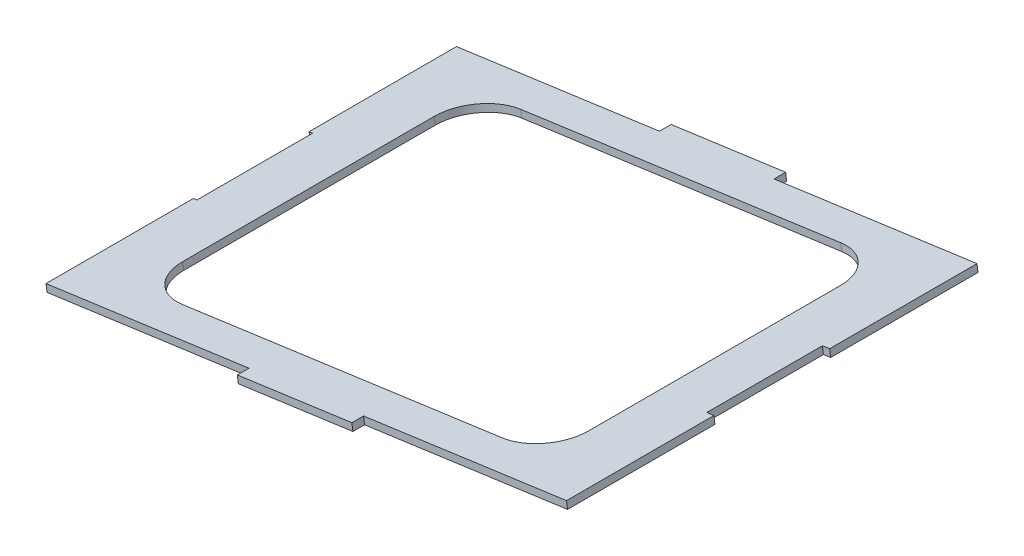
ISO-10303-21;
HEADER;
FILE_DESCRIPTION(('STEP AP214'),'2;1');
FILE_NAME('part.step','',(''),(''),'','','');
FILE_SCHEMA(('AUTOMOTIVE_DESIGN { 1 0 10303 214 1 1 1 1 }'));
ENDSEC;
DATA;
#1=APPLICATION_CONTEXT('core data for automotive mechanical design processes');
#2=APPLICATION_PROTOCOL_DEFINITION('international standard','automotive_design',2000,#1);
#3=PRODUCT_CONTEXT('',#1,'mechanical');
#4=PRODUCT('Part','Part','',(#3));
#5=PRODUCT_RELATED_PRODUCT_CATEGORY('part','',(#4));
#6=PRODUCT_DEFINITION_FORMATION('','',#4);
#7=PRODUCT_DEFINITION_CONTEXT('part definition',#1,'design');
#8=PRODUCT_DEFINITION('design','',#6,#7);
#9=PRODUCT_DEFINITION_SHAPE('','',#8);
#10=(LENGTH_UNIT() NAMED_UNIT(*) SI_UNIT(.MILLI.,.METRE.));
#11=(NAMED_UNIT(*) PLANE_ANGLE_UNIT() SI_UNIT($,.RADIAN.));
#12=(NAMED_UNIT(*) SI_UNIT($,.STERADIAN.) SOLID_ANGLE_UNIT());
#13=UNCERTAINTY_MEASURE_WITH_UNIT(LENGTH_MEASURE(1.E-05),#10,'distance_accuracy_value','');
#14=(GEOMETRIC_REPRESENTATION_CONTEXT(3) GLOBAL_UNCERTAINTY_ASSIGNED_CONTEXT((#13)) GLOBAL_UNIT_ASSIGNED_CONTEXT((#10,
#11,#12)) REPRESENTATION_CONTEXT('',''));
#15=CARTESIAN_POINT('',(0.,0.,0.));
#16=DIRECTION('',(0.,0.,1.));
#17=DIRECTION('',(1.,0.,0.));
#18=AXIS2_PLACEMENT_3D('',#15,#16,#17);
#19=CARTESIAN_POINT('',(-235.809398036046,-171.80665594088,55.2069));
#20=DIRECTION('',(0.137568371274688,-0.990492273177752,0.));
#21=DIRECTION('',(0.990492273177752,0.137568371274688,0.));
#22=AXIS2_PLACEMENT_3D('',#19,#20,#21);
#23=CYLINDRICAL_SURFACE('',#22,19.05);
#24=CARTESIAN_POINT('',(-235.372618457249,-174.951468908219,55.2069));
#25=DIRECTION('',(0.137568371274688,-0.990492273177752,0.));
#26=DIRECTION('',(0.990492273177752,0.137568371274688,0.));
#27=AXIS2_PLACEMENT_3D('',#24,#25,#26);
#28=CIRCLE('',#27,19.05);
#29=CARTESIAN_POINT('',(-235.372618457249,-174.951468908219,74.2569));
#30=VERTEX_POINT('',#29);
#31=CARTESIAN_POINT('',(-254.241496261285,-177.572146381002,55.2069));
#32=VERTEX_POINT('',#31);
#33=EDGE_CURVE('E301',#30,#32,#28,.T.);
#34=ORIENTED_EDGE('',*,*,#33,.T.);
#35=DIRECTION('',(0.137568371274688,-0.990492273177752,0.));
#36=VECTOR('',#35,1.);
#37=CARTESIAN_POINT('',(-254.678275840082,-174.427333413663,55.2069));
#38=LINE('',#37,#36);
#39=CARTESIAN_POINT('',(-254.678275840082,-174.427333413663,55.2069));
#40=VERTEX_POINT('',#39);
#41=EDGE_CURVE('E11',#40,#32,#38,.T.);
#42=ORIENTED_EDGE('',*,*,#41,.F.);
#43=CARTESIAN_POINT('',(-235.809398036046,-171.80665594088,55.2069));
#44=DIRECTION('',(0.137568371274688,-0.990492273177752,0.));
#45=DIRECTION('',(0.990492273177752,0.137568371274688,0.));
#46=AXIS2_PLACEMENT_3D('',#43,#44,#45);
#47=CIRCLE('',#46,19.05);
#48=CARTESIAN_POINT('',(-235.809398036046,-171.80665594088,74.2569));
#49=VERTEX_POINT('',#48);
#50=EDGE_CURVE('E408',#49,#40,#47,.T.);
#51=ORIENTED_EDGE('',*,*,#50,.F.);
#52=DIRECTION('',(0.137568371274688,-0.990492273177752,0.));
#53=VECTOR('',#52,1.);
#54=CARTESIAN_POINT('',(-235.809398036046,-171.80665594088,74.2569));
#55=LINE('',#54,#53);
#56=EDGE_CURVE('E329',#49,#30,#55,.T.);
#57=ORIENTED_EDGE('',*,*,#56,.T.);
#58=EDGE_LOOP('',(#34,#42,#51,#57));
#59=FACE_BOUND('',#58,.T.);
#60=ADVANCED_FACE('F35',(#59),#23,.F.);
#61=CARTESIAN_POINT('',(-254.678275840082,-174.427333413663,0.));
#62=DIRECTION('',(-0.990492273177752,-0.137568371274688,0.));
#63=DIRECTION('',(0.137568371274688,-0.990492273177752,0.));
#64=AXIS2_PLACEMENT_3D('',#61,#62,#63);
#65=PLANE('',#64);
#66=DIRECTION('',(0.,0.,-1.));
#67=VECTOR('',#66,1.);
#68=CARTESIAN_POINT('',(-254.241496261285,-177.572146381002,0.));
#69=LINE('',#68,#67);
#70=CARTESIAN_POINT('',(-254.241496261285,-177.572146381002,-55.2069000000001));
#71=VERTEX_POINT('',#70);
#72=EDGE_CURVE('E139',#32,#71,#69,.T.);
#73=ORIENTED_EDGE('',*,*,#72,.T.);
#74=DIRECTION('',(0.137568371274688,-0.990492273177752,0.));
#75=VECTOR('',#74,1.);
#76=CARTESIAN_POINT('',(-254.678275840082,-174.427333413663,-55.2069000000001));
#77=LINE('',#76,#75);
#78=CARTESIAN_POINT('',(-254.678275840082,-174.427333413663,-55.2069000000001));
#79=VERTEX_POINT('',#78);
#80=EDGE_CURVE('E45',#79,#71,#77,.T.);
#81=ORIENTED_EDGE('',*,*,#80,.F.);
#82=DIRECTION('',(0.,0.,-1.));
#83=VECTOR('',#82,1.);
#84=CARTESIAN_POINT('',(-254.678275840082,-174.427333413663,0.));
#85=LINE('',#84,#83);
#86=EDGE_CURVE('E53',#40,#79,#85,.T.);
#87=ORIENTED_EDGE('',*,*,#86,.F.);
#88=ORIENTED_EDGE('',*,*,#41,.T.);
#89=EDGE_LOOP('',(#73,#81,#87,#88));
#90=FACE_BOUND('',#89,.T.);
#91=ADVANCED_FACE('F435',(#90),#65,.F.);
#92=CARTESIAN_POINT('',(-235.809398036046,-171.80665594088,-55.2069000000001));
#93=DIRECTION('',(0.137568371274688,-0.990492273177752,0.));
#94=DIRECTION('',(0.990492273177752,0.137568371274688,0.));
#95=AXIS2_PLACEMENT_3D('',#92,#93,#94);
#96=CYLINDRICAL_SURFACE('',#95,19.05);
#97=CARTESIAN_POINT('',(-235.372618457249,-174.951468908219,-55.2069000000001));
#98=DIRECTION('',(0.137568371274688,-0.990492273177752,0.));
#99=DIRECTION('',(0.990492273177752,0.137568371274688,0.));
#100=AXIS2_PLACEMENT_3D('',#97,#98,#99);
#101=CIRCLE('',#100,19.05);
#102=CARTESIAN_POINT('',(-235.372618457249,-174.951468908219,-74.2569000000001));
#103=VERTEX_POINT('',#102);
#104=EDGE_CURVE('E237',#71,#103,#101,.T.);
#105=ORIENTED_EDGE('',*,*,#104,.T.);
#106=DIRECTION('',(0.137568371274688,-0.990492273177752,0.));
#107=VECTOR('',#106,1.);
#108=CARTESIAN_POINT('',(-235.809398036046,-171.80665594088,-74.2569000000001));
#109=LINE('',#108,#107);
#110=CARTESIAN_POINT('',(-235.809398036046,-171.80665594088,-74.2569000000001));
#111=VERTEX_POINT('',#110);
#112=EDGE_CURVE('E235',#111,#103,#109,.T.);
#113=ORIENTED_EDGE('',*,*,#112,.F.);
#114=CARTESIAN_POINT('',(-235.809398036046,-171.80665594088,-55.2069000000001));
#115=DIRECTION('',(0.137568371274688,-0.990492273177752,0.));
#116=DIRECTION('',(0.990492273177752,0.137568371274688,0.));
#117=AXIS2_PLACEMENT_3D('',#114,#115,#116);
#118=CIRCLE('',#117,19.05);
#119=EDGE_CURVE('E226',#79,#111,#118,.T.);
#120=ORIENTED_EDGE('',*,*,#119,.F.);
#121=ORIENTED_EDGE('',*,*,#80,.T.);
#122=EDGE_LOOP('',(#105,#113,#120,#121));
#123=FACE_BOUND('',#122,.T.);
#124=ADVANCED_FACE('F236',(#123),#96,.F.);
#125=CARTESIAN_POINT('',(18.9477389238889,-136.423720252,-74.2569));
#126=DIRECTION('',(0.,0.,-1.));
#127=DIRECTION('',(-1.,0.,0.));
#128=AXIS2_PLACEMENT_3D('',#125,#126,#127);
#129=PLANE('',#128);
#130=DIRECTION('',(0.990492273177752,0.137568371274688,0.));
#131=VECTOR('',#130,1.);
#132=CARTESIAN_POINT('',(19.3845185026861,-139.568533219339,-74.2569));
#133=LINE('',#132,#131);
#134=CARTESIAN_POINT('',(-94.8273815427511,-155.431297114539,-74.2569000000001));
#135=VERTEX_POINT('',#134);
#136=EDGE_CURVE('E316',#103,#135,#133,.T.);
#137=ORIENTED_EDGE('',*,*,#136,.T.);
#138=DIRECTION('',(0.137568371274688,-0.990492273177752,0.));
#139=VECTOR('',#138,1.);
#140=CARTESIAN_POINT('',(-95.2641611215483,-152.2864841472,-74.2569000000001));
#141=LINE('',#140,#139);
#142=CARTESIAN_POINT('',(-95.2641611215483,-152.2864841472,-74.2569000000001));
#143=VERTEX_POINT('',#142);
#144=EDGE_CURVE('E240',#143,#135,#141,.T.);
#145=ORIENTED_EDGE('',*,*,#144,.F.);
#146=DIRECTION('',(0.990492273177752,0.137568371274688,0.));
#147=VECTOR('',#146,1.);
#148=CARTESIAN_POINT('',(18.9477389238889,-136.423720252,-74.2569));
#149=LINE('',#148,#147);
#150=EDGE_CURVE('E230',#111,#143,#149,.T.);
#151=ORIENTED_EDGE('',*,*,#150,.F.);
#152=ORIENTED_EDGE('',*,*,#112,.T.);
#153=EDGE_LOOP('',(#137,#145,#151,#152));
#154=FACE_BOUND('',#153,.T.);
#155=ADVANCED_FACE('F242',(#154),#129,.F.);
#156=CARTESIAN_POINT('',(-95.2641611215483,-152.2864841472,-55.2069000000001));
#157=DIRECTION('',(0.137568371274688,-0.990492273177752,0.));
#158=DIRECTION('',(0.990492273177752,0.137568371274688,0.));
#159=AXIS2_PLACEMENT_3D('',#156,#157,#158);
#160=CYLINDRICAL_SURFACE('',#159,19.05);
#161=CARTESIAN_POINT('',(-94.8273815427511,-155.431297114539,-55.2069000000001));
#162=DIRECTION('',(0.137568371274688,-0.990492273177752,0.));
#163=DIRECTION('',(0.990492273177752,0.137568371274688,0.));
#164=AXIS2_PLACEMENT_3D('',#161,#162,#163);
#165=CIRCLE('',#164,19.05);
#166=CARTESIAN_POINT('',(-75.958503738715,-152.810619641756,-55.2069000000001));
#167=VERTEX_POINT('',#166);
#168=EDGE_CURVE('E313',#135,#167,#165,.T.);
#169=ORIENTED_EDGE('',*,*,#168,.T.);
#170=DIRECTION('',(0.137568371274688,-0.990492273177752,0.));
#171=VECTOR('',#170,1.);
#172=CARTESIAN_POINT('',(-76.3952833175121,-149.665806674417,-55.2069000000001));
#173=LINE('',#172,#171);
#174=CARTESIAN_POINT('',(-76.3952833175121,-149.665806674417,-55.2069000000001));
#175=VERTEX_POINT('',#174);
#176=EDGE_CURVE('E323',#175,#167,#173,.T.);
#177=ORIENTED_EDGE('',*,*,#176,.F.);
#178=CARTESIAN_POINT('',(-95.2641611215483,-152.2864841472,-55.2069000000001));
#179=DIRECTION('',(0.137568371274688,-0.990492273177752,0.));
#180=DIRECTION('',(0.990492273177752,0.137568371274688,0.));
#181=AXIS2_PLACEMENT_3D('',#178,#179,#180);
#182=CIRCLE('',#181,19.05);
#183=EDGE_CURVE('E245',#143,#175,#182,.T.);
#184=ORIENTED_EDGE('',*,*,#183,.F.);
#185=ORIENTED_EDGE('',*,*,#144,.T.);
#186=EDGE_LOOP('',(#169,#177,#184,#185));
#187=FACE_BOUND('',#186,.T.);
#188=ADVANCED_FACE('F424',(#187),#160,.F.);
#189=CARTESIAN_POINT('',(-76.3952833175121,-149.665806674417,0.));
#190=DIRECTION('',(-0.990492273177752,-0.137568371274688,0.));
#191=DIRECTION('',(0.137568371274688,-0.990492273177752,0.));
#192=AXIS2_PLACEMENT_3D('',#189,#190,#191);
#193=PLANE('',#192);
#194=DIRECTION('',(0.,0.,-1.));
#195=VECTOR('',#194,1.);
#196=CARTESIAN_POINT('',(-75.958503738715,-152.810619641756,0.));
#197=LINE('',#196,#195);
#198=CARTESIAN_POINT('',(-75.958503738715,-152.810619641756,55.2069));
#199=VERTEX_POINT('',#198);
#200=EDGE_CURVE('E310',#199,#167,#197,.T.);
#201=ORIENTED_EDGE('',*,*,#200,.F.);
#202=DIRECTION('',(0.137568371274688,-0.990492273177752,0.));
#203=VECTOR('',#202,1.);
#204=CARTESIAN_POINT('',(-76.3952833175121,-149.665806674417,55.2069));
#205=LINE('',#204,#203);
#206=CARTESIAN_POINT('',(-76.3952833175121,-149.665806674417,55.2069));
#207=VERTEX_POINT('',#206);
#208=EDGE_CURVE('E325',#207,#199,#205,.T.);
#209=ORIENTED_EDGE('',*,*,#208,.F.);
#210=DIRECTION('',(0.,0.,-1.));
#211=VECTOR('',#210,1.);
#212=CARTESIAN_POINT('',(-76.3952833175121,-149.665806674417,0.));
#213=LINE('',#212,#211);
#214=EDGE_CURVE('E247',#207,#175,#213,.T.);
#215=ORIENTED_EDGE('',*,*,#214,.T.);
#216=ORIENTED_EDGE('',*,*,#176,.T.);
#217=EDGE_LOOP('',(#201,#209,#215,#216));
#218=FACE_BOUND('',#217,.T.);
#219=ADVANCED_FACE('F418',(#218),#193,.T.);
#220=CARTESIAN_POINT('',(-95.2641611215483,-152.2864841472,55.2069));
#221=DIRECTION('',(0.137568371274688,-0.990492273177752,0.));
#222=DIRECTION('',(0.990492273177752,0.137568371274688,0.));
#223=AXIS2_PLACEMENT_3D('',#220,#221,#222);
#224=CYLINDRICAL_SURFACE('',#223,19.05);
#225=CARTESIAN_POINT('',(-94.8273815427512,-155.431297114539,55.2069));
#226=DIRECTION('',(0.137568371274688,-0.990492273177752,0.));
#227=DIRECTION('',(0.990492273177752,0.137568371274688,0.));
#228=AXIS2_PLACEMENT_3D('',#225,#226,#227);
#229=CIRCLE('',#228,19.05);
#230=CARTESIAN_POINT('',(-94.8273815427512,-155.431297114539,74.2569));
#231=VERTEX_POINT('',#230);
#232=EDGE_CURVE('E307',#199,#231,#229,.T.);
#233=ORIENTED_EDGE('',*,*,#232,.T.);
#234=DIRECTION('',(0.137568371274688,-0.990492273177752,0.));
#235=VECTOR('',#234,1.);
#236=CARTESIAN_POINT('',(-95.2641611215483,-152.2864841472,74.2569));
#237=LINE('',#236,#235);
#238=CARTESIAN_POINT('',(-95.2641611215483,-152.2864841472,74.2569));
#239=VERTEX_POINT('',#238);
#240=EDGE_CURVE('E327',#239,#231,#237,.T.);
#241=ORIENTED_EDGE('',*,*,#240,.F.);
#242=CARTESIAN_POINT('',(-95.2641611215483,-152.2864841472,55.2069));
#243=DIRECTION('',(0.137568371274688,-0.990492273177752,0.));
#244=DIRECTION('',(0.990492273177752,0.137568371274688,0.));
#245=AXIS2_PLACEMENT_3D('',#242,#243,#244);
#246=CIRCLE('',#245,19.05);
#247=EDGE_CURVE('E413',#207,#239,#246,.T.);
#248=ORIENTED_EDGE('',*,*,#247,.F.);
#249=ORIENTED_EDGE('',*,*,#208,.T.);
#250=EDGE_LOOP('',(#233,#241,#248,#249));
#251=FACE_BOUND('',#250,.T.);
#252=ADVANCED_FACE('F429',(#251),#224,.F.);
#253=CARTESIAN_POINT('',(18.947738923889,-136.423720252,25.3999999999993));
#254=DIRECTION('',(0.,0.,-1.));
#255=DIRECTION('',(-1.,0.,0.));
#256=AXIS2_PLACEMENT_3D('',#253,#254,#255);
#257=PLANE('',#256);
#258=DIRECTION('',(0.990492273177752,0.137568371274688,0.));
#259=VECTOR('',#258,1.);
#260=CARTESIAN_POINT('',(19.3845185026861,-139.568533219339,25.3999999999993));
#261=LINE('',#260,#259);
#262=CARTESIAN_POINT('',(-279.4,-181.066383011379,25.4));
#263=VERTEX_POINT('',#262);
#264=CARTESIAN_POINT('',(-277.82759351633,-180.847993221981,25.4));
#265=VERTEX_POINT('',#264);
#266=EDGE_CURVE('E252',#263,#265,#261,.T.);
#267=ORIENTED_EDGE('',*,*,#266,.F.);
#268=DIRECTION('',(0.137568371274688,-0.990492273177752,0.));
#269=VECTOR('',#268,1.);
#270=CARTESIAN_POINT('',(-279.836779578797,-177.92157004404,25.4));
#271=LINE('',#270,#269);
#272=CARTESIAN_POINT('',(-279.836779578797,-177.92157004404,25.4));
#273=VERTEX_POINT('',#272);
#274=EDGE_CURVE('E331',#273,#263,#271,.T.);
#275=ORIENTED_EDGE('',*,*,#274,.F.);
#276=DIRECTION('',(0.990492273177752,0.137568371274688,0.));
#277=VECTOR('',#276,1.);
#278=CARTESIAN_POINT('',(18.947738923889,-136.423720252,25.3999999999993));
#279=LINE('',#278,#277);
#280=CARTESIAN_POINT('',(-278.264373095128,-177.703180254641,25.4));
#281=VERTEX_POINT('',#280);
#282=EDGE_CURVE('E319',#273,#281,#279,.T.);
#283=ORIENTED_EDGE('',*,*,#282,.T.);
#284=DIRECTION('',(0.137568371274688,-0.990492273177752,0.));
#285=VECTOR('',#284,1.);
#286=CARTESIAN_POINT('',(-278.264373095128,-177.703180254641,25.4));
#287=LINE('',#286,#285);
#288=EDGE_CURVE('E39',#281,#265,#287,.T.);
#289=ORIENTED_EDGE('',*,*,#288,.T.);
#290=EDGE_LOOP('',(#267,#275,#283,#289));
#291=FACE_BOUND('',#290,.T.);
#292=ADVANCED_FACE('F37',(#291),#257,.T.);
#293=CARTESIAN_POINT('',(-279.836779578797,-177.92157004404,0.));
#294=DIRECTION('',(-0.990492273177752,-0.137568371274688,0.));
#295=DIRECTION('',(0.137568371274688,-0.990492273177752,0.));
#296=AXIS2_PLACEMENT_3D('',#293,#294,#295);
#297=PLANE('',#296);
#298=DIRECTION('',(0.,0.,-1.));
#299=VECTOR('',#298,1.);
#300=CARTESIAN_POINT('',(-279.4,-181.066383011379,0.));
#301=LINE('',#300,#299);
#302=CARTESIAN_POINT('',(-279.4,-181.066383011379,90.1319));
#303=VERTEX_POINT('',#302);
#304=EDGE_CURVE('E265',#303,#263,#301,.T.);
#305=ORIENTED_EDGE('',*,*,#304,.F.);
#306=DIRECTION('',(0.137568371274688,-0.990492273177752,0.));
#307=VECTOR('',#306,1.);
#308=CARTESIAN_POINT('',(-279.836779578797,-177.92157004404,90.1319));
#309=LINE('',#308,#307);
#310=CARTESIAN_POINT('',(-279.836779578797,-177.92157004404,90.1319));
#311=VERTEX_POINT('',#310);
#312=EDGE_CURVE('E333',#311,#303,#309,.T.);
#313=ORIENTED_EDGE('',*,*,#312,.F.);
#314=DIRECTION('',(0.,0.,-1.));
#315=VECTOR('',#314,1.);
#316=CARTESIAN_POINT('',(-279.836779578797,-177.92157004404,0.));
#317=LINE('',#316,#315);
#318=EDGE_CURVE('E401',#311,#273,#317,.T.);
#319=ORIENTED_EDGE('',*,*,#318,.T.);
#320=ORIENTED_EDGE('',*,*,#274,.T.);
#321=EDGE_LOOP('',(#305,#313,#319,#320));
#322=FACE_BOUND('',#321,.T.);
#323=ADVANCED_FACE('F457',(#322),#297,.T.);
#324=CARTESIAN_POINT('',(18.9477389238889,-136.423720252,90.1319));
#325=DIRECTION('',(0.,0.,-1.));
#326=DIRECTION('',(-1.,0.,0.));
#327=AXIS2_PLACEMENT_3D('',#324,#325,#326);
#328=PLANE('',#327);
#329=DIRECTION('',(0.990492273177752,0.137568371274688,0.));
#330=VECTOR('',#329,1.);
#331=CARTESIAN_POINT('',(19.3845185026861,-139.568533219339,90.1319));
#332=LINE('',#331,#330);
#333=CARTESIAN_POINT('',(-190.258503738715,-168.685619641756,90.1319000000001));
#334=VERTEX_POINT('',#333);
#335=EDGE_CURVE('E293',#303,#334,#332,.T.);
#336=ORIENTED_EDGE('',*,*,#335,.T.);
#337=DIRECTION('',(0.137568371274688,-0.990492273177752,0.));
#338=VECTOR('',#337,1.);
#339=CARTESIAN_POINT('',(-190.695283317512,-165.540806674417,90.1319000000001));
#340=LINE('',#339,#338);
#341=CARTESIAN_POINT('',(-190.695283317512,-165.540806674417,90.1319000000001));
#342=VERTEX_POINT('',#341);
#343=EDGE_CURVE('E335',#342,#334,#340,.T.);
#344=ORIENTED_EDGE('',*,*,#343,.F.);
#345=DIRECTION('',(0.990492273177752,0.137568371274688,0.));
#346=VECTOR('',#345,1.);
#347=CARTESIAN_POINT('',(18.9477389238889,-136.423720252,90.1319));
#348=LINE('',#347,#346);
#349=EDGE_CURVE('E398',#311,#342,#348,.T.);
#350=ORIENTED_EDGE('',*,*,#349,.F.);
#351=ORIENTED_EDGE('',*,*,#312,.T.);
#352=EDGE_LOOP('',(#336,#344,#350,#351));
#353=FACE_BOUND('',#352,.T.);
#354=ADVANCED_FACE('F385',(#353),#328,.F.);
#355=CARTESIAN_POINT('',(-190.695283317512,-165.540806674417,0.));
#356=DIRECTION('',(-0.990492273177752,-0.137568371274688,0.));
#357=DIRECTION('',(0.137568371274688,-0.990492273177752,0.));
#358=AXIS2_PLACEMENT_3D('',#355,#356,#357);
#359=PLANE('',#358);
#360=DIRECTION('',(0.,0.,-1.));
#361=VECTOR('',#360,1.);
#362=CARTESIAN_POINT('',(-190.258503738715,-168.685619641756,0.));
#363=LINE('',#362,#361);
#364=CARTESIAN_POINT('',(-190.258503738715,-168.685619641756,95.2500000000001));
#365=VERTEX_POINT('',#364);
#366=EDGE_CURVE('E298',#365,#334,#363,.T.);
#367=ORIENTED_EDGE('',*,*,#366,.F.);
#368=DIRECTION('',(0.137568371274688,-0.990492273177752,0.));
#369=VECTOR('',#368,1.);
#370=CARTESIAN_POINT('',(-190.695283317512,-165.540806674417,95.2500000000001));
#371=LINE('',#370,#369);
#372=CARTESIAN_POINT('',(-190.695283317512,-165.540806674417,95.2500000000001));
#373=VERTEX_POINT('',#372);
#374=EDGE_CURVE('E337',#373,#365,#371,.T.);
#375=ORIENTED_EDGE('',*,*,#374,.F.);
#376=DIRECTION('',(0.,0.,-1.));
#377=VECTOR('',#376,1.);
#378=CARTESIAN_POINT('',(-190.695283317512,-165.540806674417,0.));
#379=LINE('',#378,#377);
#380=EDGE_CURVE('E394',#373,#342,#379,.T.);
#381=ORIENTED_EDGE('',*,*,#380,.T.);
#382=ORIENTED_EDGE('',*,*,#343,.T.);
#383=EDGE_LOOP('',(#367,#375,#381,#382));
#384=FACE_BOUND('',#383,.T.);
#385=ADVANCED_FACE('F392',(#384),#359,.T.);
#386=CARTESIAN_POINT('',(18.9477389238889,-136.423720252,95.2500000000001));
#387=DIRECTION('',(0.,0.,1.));
#388=DIRECTION('',(1.,0.,0.));
#389=AXIS2_PLACEMENT_3D('',#386,#387,#388);
#390=PLANE('',#389);
#391=DIRECTION('',(-0.990492273177752,-0.137568371274688,0.));
#392=VECTOR('',#391,1.);
#393=CARTESIAN_POINT('',(19.3845185026861,-139.568533219339,95.2500000000001));
#394=LINE('',#393,#392);
#395=CARTESIAN_POINT('',(-139.941496261285,-161.697146381002,95.2500000000001));
#396=VERTEX_POINT('',#395);
#397=EDGE_CURVE('E295',#396,#365,#394,.T.);
#398=ORIENTED_EDGE('',*,*,#397,.F.);
#399=DIRECTION('',(0.137568371274688,-0.990492273177752,0.));
#400=VECTOR('',#399,1.);
#401=CARTESIAN_POINT('',(-140.378275840082,-158.552333413663,95.2500000000001));
#402=LINE('',#401,#400);
#403=CARTESIAN_POINT('',(-140.378275840082,-158.552333413663,95.2500000000001));
#404=VERTEX_POINT('',#403);
#405=EDGE_CURVE('E339',#404,#396,#402,.T.);
#406=ORIENTED_EDGE('',*,*,#405,.F.);
#407=DIRECTION('',(-0.990492273177752,-0.137568371274688,0.));
#408=VECTOR('',#407,1.);
#409=CARTESIAN_POINT('',(18.9477389238889,-136.423720252,95.2500000000001));
#410=LINE('',#409,#408);
#411=EDGE_CURVE('E399',#404,#373,#410,.T.);
#412=ORIENTED_EDGE('',*,*,#411,.T.);
#413=ORIENTED_EDGE('',*,*,#374,.T.);
#414=EDGE_LOOP('',(#398,#406,#412,#413));
#415=FACE_BOUND('',#414,.T.);
#416=ADVANCED_FACE('F466',(#415),#390,.T.);
#417=CARTESIAN_POINT('',(-140.378275840082,-158.552333413663,0.));
#418=DIRECTION('',(-0.990492273177752,-0.137568371274688,0.));
#419=DIRECTION('',(0.137568371274688,-0.990492273177752,0.));
#420=AXIS2_PLACEMENT_3D('',#417,#418,#419);
#421=PLANE('',#420);
#422=DIRECTION('',(0.,0.,-1.));
#423=VECTOR('',#422,1.);
#424=CARTESIAN_POINT('',(-139.941496261285,-161.697146381002,0.));
#425=LINE('',#424,#423);
#426=CARTESIAN_POINT('',(-139.941496261285,-161.697146381002,90.1319000000001));
#427=VERTEX_POINT('',#426);
#428=EDGE_CURVE('E292',#396,#427,#425,.T.);
#429=ORIENTED_EDGE('',*,*,#428,.T.);
#430=DIRECTION('',(0.137568371274688,-0.990492273177752,0.));
#431=VECTOR('',#430,1.);
#432=CARTESIAN_POINT('',(-140.378275840082,-158.552333413663,90.1319000000001));
#433=LINE('',#432,#431);
#434=CARTESIAN_POINT('',(-140.378275840082,-158.552333413663,90.1319000000001));
#435=VERTEX_POINT('',#434);
#436=EDGE_CURVE('E341',#435,#427,#433,.T.);
#437=ORIENTED_EDGE('',*,*,#436,.F.);
#438=DIRECTION('',(0.,0.,-1.));
#439=VECTOR('',#438,1.);
#440=CARTESIAN_POINT('',(-140.378275840082,-158.552333413663,0.));
#441=LINE('',#440,#439);
#442=EDGE_CURVE('E404',#404,#435,#441,.T.);
#443=ORIENTED_EDGE('',*,*,#442,.F.);
#444=ORIENTED_EDGE('',*,*,#405,.T.);
#445=EDGE_LOOP('',(#429,#437,#443,#444));
#446=FACE_BOUND('',#445,.T.);
#447=ADVANCED_FACE('F469',(#446),#421,.F.);
#448=CARTESIAN_POINT('',(-50.8,-149.316383011379,90.1319));
#449=VERTEX_POINT('',#448);
#450=EDGE_CURVE('E289',#427,#449,#332,.T.);
#451=ORIENTED_EDGE('',*,*,#450,.T.);
#452=DIRECTION('',(0.137568371274688,-0.990492273177752,0.));
#453=VECTOR('',#452,1.);
#454=CARTESIAN_POINT('',(-51.2367795787971,-146.17157004404,90.1319));
#455=LINE('',#454,#453);
#456=CARTESIAN_POINT('',(-51.2367795787971,-146.17157004404,90.1319));
#457=VERTEX_POINT('',#456);
#458=EDGE_CURVE('E344',#457,#449,#455,.T.);
#459=ORIENTED_EDGE('',*,*,#458,.F.);
#460=EDGE_CURVE('E403',#435,#457,#348,.T.);
#461=ORIENTED_EDGE('',*,*,#460,.F.);
#462=ORIENTED_EDGE('',*,*,#436,.T.);
#463=EDGE_LOOP('',(#451,#459,#461,#462));
#464=FACE_BOUND('',#463,.T.);
#465=ADVANCED_FACE('F463',(#464),#328,.F.);
#466=CARTESIAN_POINT('',(-51.2367795787971,-146.17157004404,0.));
#467=DIRECTION('',(0.990492273177752,0.137568371274688,0.));
#468=DIRECTION('',(-0.137568371274688,0.990492273177752,0.));
#469=AXIS2_PLACEMENT_3D('',#466,#467,#468);
#470=PLANE('',#469);
#471=DIRECTION('',(0.,0.,1.));
#472=VECTOR('',#471,1.);
#473=CARTESIAN_POINT('',(-50.8,-149.316383011379,0.));
#474=LINE('',#473,#472);
#475=CARTESIAN_POINT('',(-50.8,-149.316383011379,25.4));
#476=VERTEX_POINT('',#475);
#477=EDGE_CURVE('E282',#476,#449,#474,.T.);
#478=ORIENTED_EDGE('',*,*,#477,.F.);
#479=DIRECTION('',(0.137568371274688,-0.990492273177752,0.));
#480=VECTOR('',#479,1.);
#481=CARTESIAN_POINT('',(-51.2367795787971,-146.17157004404,25.4));
#482=LINE('',#481,#480);
#483=CARTESIAN_POINT('',(-51.2367795787971,-146.17157004404,25.4));
#484=VERTEX_POINT('',#483);
#485=EDGE_CURVE('E346',#484,#476,#482,.T.);
#486=ORIENTED_EDGE('',*,*,#485,.F.);
#487=DIRECTION('',(0.,0.,1.));
#488=VECTOR('',#487,1.);
#489=CARTESIAN_POINT('',(-51.2367795787971,-146.17157004404,0.));
#490=LINE('',#489,#488);
#491=EDGE_CURVE('E744',#484,#457,#490,.T.);
#492=ORIENTED_EDGE('',*,*,#491,.T.);
#493=ORIENTED_EDGE('',*,*,#458,.T.);
#494=EDGE_LOOP('',(#478,#486,#492,#493));
#495=FACE_BOUND('',#494,.T.);
#496=ADVANCED_FACE('F474',(#495),#470,.T.);
#497=CARTESIAN_POINT('',(18.947738923889,-136.423720252,25.3999999999998));
#498=DIRECTION('',(0.,0.,1.));
#499=DIRECTION('',(1.,0.,0.));
#500=AXIS2_PLACEMENT_3D('',#497,#498,#499);
#501=PLANE('',#500);
#502=DIRECTION('',(-0.990492273177752,-0.137568371274688,0.));
#503=VECTOR('',#502,1.);
#504=CARTESIAN_POINT('',(19.3845185026861,-139.568533219339,25.3999999999998));
#505=LINE('',#504,#503);
#506=CARTESIAN_POINT('',(-53.9448129673394,-149.753162590176,25.4));
#507=VERTEX_POINT('',#506);
#508=EDGE_CURVE('E287',#476,#507,#505,.T.);
#509=ORIENTED_EDGE('',*,*,#508,.T.);
#510=DIRECTION('',(0.137568371274688,-0.990492273177752,0.));
#511=VECTOR('',#510,1.);
#512=CARTESIAN_POINT('',(-54.3815925461366,-146.608349622837,25.4));
#513=LINE('',#512,#511);
#514=CARTESIAN_POINT('',(-54.3815925461366,-146.608349622837,25.4));
#515=VERTEX_POINT('',#514);
#516=EDGE_CURVE('E348',#515,#507,#513,.T.);
#517=ORIENTED_EDGE('',*,*,#516,.F.);
#518=DIRECTION('',(-0.990492273177752,-0.137568371274688,0.));
#519=VECTOR('',#518,1.);
#520=CARTESIAN_POINT('',(18.947738923889,-136.423720252,25.3999999999998));
#521=LINE('',#520,#519);
#522=EDGE_CURVE('E745',#484,#515,#521,.T.);
#523=ORIENTED_EDGE('',*,*,#522,.F.);
#524=ORIENTED_EDGE('',*,*,#485,.T.);
#525=EDGE_LOOP('',(#509,#517,#523,#524));
#526=FACE_BOUND('',#525,.T.);
#527=ADVANCED_FACE('F477',(#526),#501,.F.);
#528=CARTESIAN_POINT('',(-54.3815925461366,-146.608349622837,0.));
#529=DIRECTION('',(-0.990492273177752,-0.137568371274688,0.));
#530=DIRECTION('',(0.137568371274688,-0.990492273177752,0.));
#531=AXIS2_PLACEMENT_3D('',#528,#529,#530);
#532=PLANE('',#531);
#533=DIRECTION('',(0.,0.,-1.));
#534=VECTOR('',#533,1.);
#535=CARTESIAN_POINT('',(-53.9448129673394,-149.753162590176,0.));
#536=LINE('',#535,#534);
#537=CARTESIAN_POINT('',(-53.9448129673394,-149.753162590176,-25.4));
#538=VERTEX_POINT('',#537);
#539=EDGE_CURVE('E285',#507,#538,#536,.T.);
#540=ORIENTED_EDGE('',*,*,#539,.T.);
#541=DIRECTION('',(0.137568371274688,-0.990492273177752,0.));
#542=VECTOR('',#541,1.);
#543=CARTESIAN_POINT('',(-54.3815925461366,-146.608349622837,-25.4));
#544=LINE('',#543,#542);
#545=CARTESIAN_POINT('',(-54.3815925461366,-146.608349622837,-25.4));
#546=VERTEX_POINT('',#545);
#547=EDGE_CURVE('E351',#546,#538,#544,.T.);
#548=ORIENTED_EDGE('',*,*,#547,.F.);
#549=DIRECTION('',(0.,0.,-1.));
#550=VECTOR('',#549,1.);
#551=CARTESIAN_POINT('',(-54.3815925461366,-146.608349622837,0.));
#552=LINE('',#551,#550);
#553=EDGE_CURVE('E748',#515,#546,#552,.T.);
#554=ORIENTED_EDGE('',*,*,#553,.F.);
#555=ORIENTED_EDGE('',*,*,#516,.T.);
#556=EDGE_LOOP('',(#540,#548,#554,#555));
#557=FACE_BOUND('',#556,.T.);
#558=ADVANCED_FACE('F482',(#557),#532,.F.);
#559=CARTESIAN_POINT('',(18.9477389238889,-136.423720252,-25.4));
#560=DIRECTION('',(0.,0.,-1.));
#561=DIRECTION('',(-1.,0.,0.));
#562=AXIS2_PLACEMENT_3D('',#559,#560,#561);
#563=PLANE('',#562);
#564=DIRECTION('',(0.990492273177752,0.137568371274688,0.));
#565=VECTOR('',#564,1.);
#566=CARTESIAN_POINT('',(19.3845185026861,-139.568533219339,-25.4));
#567=LINE('',#566,#565);
#568=CARTESIAN_POINT('',(-50.8,-149.316383011379,-25.4));
#569=VERTEX_POINT('',#568);
#570=EDGE_CURVE('E281',#538,#569,#567,.T.);
#571=ORIENTED_EDGE('',*,*,#570,.T.);
#572=DIRECTION('',(0.137568371274688,-0.990492273177752,0.));
#573=VECTOR('',#572,1.);
#574=CARTESIAN_POINT('',(-51.2367795787971,-146.17157004404,-25.4));
#575=LINE('',#574,#573);
#576=CARTESIAN_POINT('',(-51.2367795787971,-146.17157004404,-25.4));
#577=VERTEX_POINT('',#576);
#578=EDGE_CURVE('E354',#577,#569,#575,.T.);
#579=ORIENTED_EDGE('',*,*,#578,.F.);
#580=DIRECTION('',(0.990492273177752,0.137568371274688,0.));
#581=VECTOR('',#580,1.);
#582=CARTESIAN_POINT('',(18.9477389238889,-136.423720252,-25.4));
#583=LINE('',#582,#581);
#584=EDGE_CURVE('E753',#546,#577,#583,.T.);
#585=ORIENTED_EDGE('',*,*,#584,.F.);
#586=ORIENTED_EDGE('',*,*,#547,.T.);
#587=EDGE_LOOP('',(#571,#579,#585,#586));
#588=FACE_BOUND('',#587,.T.);
#589=ADVANCED_FACE('F486',(#588),#563,.F.);
#590=CARTESIAN_POINT('',(-50.8,-149.316383011379,-90.1319000000001));
#591=VERTEX_POINT('',#590);
#592=EDGE_CURVE('E278',#591,#569,#474,.T.);
#593=ORIENTED_EDGE('',*,*,#592,.F.);
#594=DIRECTION('',(0.137568371274688,-0.990492273177752,0.));
#595=VECTOR('',#594,1.);
#596=CARTESIAN_POINT('',(-51.2367795787971,-146.17157004404,-90.1319000000001));
#597=LINE('',#596,#595);
#598=CARTESIAN_POINT('',(-51.2367795787971,-146.17157004404,-90.1319000000001));
#599=VERTEX_POINT('',#598);
#600=EDGE_CURVE('E356',#599,#591,#597,.T.);
#601=ORIENTED_EDGE('',*,*,#600,.F.);
#602=EDGE_CURVE('E747',#599,#577,#490,.T.);
#603=ORIENTED_EDGE('',*,*,#602,.T.);
#604=ORIENTED_EDGE('',*,*,#578,.T.);
#605=EDGE_LOOP('',(#593,#601,#603,#604));
#606=FACE_BOUND('',#605,.T.);
#607=ADVANCED_FACE('F479',(#606),#470,.T.);
#608=CARTESIAN_POINT('',(18.9477389238889,-136.423720252,-90.1319000000001));
#609=DIRECTION('',(0.,0.,-1.));
#610=DIRECTION('',(-1.,0.,0.));
#611=AXIS2_PLACEMENT_3D('',#608,#609,#610);
#612=PLANE('',#611);
#613=DIRECTION('',(0.990492273177752,0.137568371274688,0.));
#614=VECTOR('',#613,1.);
#615=CARTESIAN_POINT('',(19.3845185026861,-139.568533219339,-90.1319000000001));
#616=LINE('',#615,#614);
#617=CARTESIAN_POINT('',(-139.941496261285,-161.697146381002,-90.1319000000001));
#618=VERTEX_POINT('',#617);
#619=EDGE_CURVE('E269',#618,#591,#616,.T.);
#620=ORIENTED_EDGE('',*,*,#619,.F.);
#621=DIRECTION('',(0.137568371274688,-0.990492273177752,0.));
#622=VECTOR('',#621,1.);
#623=CARTESIAN_POINT('',(-140.378275840082,-158.552333413663,-90.1319000000001));
#624=LINE('',#623,#622);
#625=CARTESIAN_POINT('',(-140.378275840082,-158.552333413663,-90.1319000000001));
#626=VERTEX_POINT('',#625);
#627=EDGE_CURVE('E358',#626,#618,#624,.T.);
#628=ORIENTED_EDGE('',*,*,#627,.F.);
#629=DIRECTION('',(0.990492273177752,0.137568371274688,0.));
#630=VECTOR('',#629,1.);
#631=CARTESIAN_POINT('',(18.9477389238889,-136.423720252,-90.1319000000001));
#632=LINE('',#631,#630);
#633=EDGE_CURVE('E754',#626,#599,#632,.T.);
#634=ORIENTED_EDGE('',*,*,#633,.T.);
#635=ORIENTED_EDGE('',*,*,#600,.T.);
#636=EDGE_LOOP('',(#620,#628,#634,#635));
#637=FACE_BOUND('',#636,.T.);
#638=ADVANCED_FACE('F491',(#637),#612,.T.);
#639=CARTESIAN_POINT('',(-140.378275840082,-158.552333413663,8.6207319755131E-13));
#640=DIRECTION('',(-0.990492273177752,-0.137568371274688,0.));
#641=DIRECTION('',(0.137568371274688,-0.990492273177752,0.));
#642=AXIS2_PLACEMENT_3D('',#639,#640,#641);
#643=PLANE('',#642);
#644=DIRECTION('',(0.,0.,-1.));
#645=VECTOR('',#644,1.);
#646=CARTESIAN_POINT('',(-139.941496261285,-161.697146381002,8.6207319755131E-13));
#647=LINE('',#646,#645);
#648=CARTESIAN_POINT('',(-139.941496261285,-161.697146381002,-95.25));
#649=VERTEX_POINT('',#648);
#650=EDGE_CURVE('E275',#618,#649,#647,.T.);
#651=ORIENTED_EDGE('',*,*,#650,.T.);
#652=DIRECTION('',(0.137568371274688,-0.990492273177752,0.));
#653=VECTOR('',#652,1.);
#654=CARTESIAN_POINT('',(-140.378275840082,-158.552333413663,-95.25));
#655=LINE('',#654,#653);
#656=CARTESIAN_POINT('',(-140.378275840082,-158.552333413663,-95.25));
#657=VERTEX_POINT('',#656);
#658=EDGE_CURVE('E360',#657,#649,#655,.T.);
#659=ORIENTED_EDGE('',*,*,#658,.F.);
#660=DIRECTION('',(0.,0.,-1.));
#661=VECTOR('',#660,1.);
#662=CARTESIAN_POINT('',(-140.378275840082,-158.552333413663,8.6207319755131E-13));
#663=LINE('',#662,#661);
#664=EDGE_CURVE('E757',#626,#657,#663,.T.);
#665=ORIENTED_EDGE('',*,*,#664,.F.);
#666=ORIENTED_EDGE('',*,*,#627,.T.);
#667=EDGE_LOOP('',(#651,#659,#665,#666));
#668=FACE_BOUND('',#667,.T.);
#669=ADVANCED_FACE('F494',(#668),#643,.F.);
#670=CARTESIAN_POINT('',(18.9477389238889,-136.423720252,-95.2500000000001));
#671=DIRECTION('',(0.,0.,-1.));
#672=DIRECTION('',(-1.,0.,0.));
#673=AXIS2_PLACEMENT_3D('',#670,#671,#672);
#674=PLANE('',#673);
#675=DIRECTION('',(0.990492273177752,0.137568371274688,0.));
#676=VECTOR('',#675,1.);
#677=CARTESIAN_POINT('',(19.384518502686,-139.568533219339,-95.2500000000001));
#678=LINE('',#677,#676);
#679=CARTESIAN_POINT('',(-190.258503738715,-168.685619641756,-95.25));
#680=VERTEX_POINT('',#679);
#681=EDGE_CURVE('E272',#680,#649,#678,.T.);
#682=ORIENTED_EDGE('',*,*,#681,.F.);
#683=DIRECTION('',(0.137568371274688,-0.990492273177752,0.));
#684=VECTOR('',#683,1.);
#685=CARTESIAN_POINT('',(-190.695283317512,-165.540806674417,-95.25));
#686=LINE('',#685,#684);
#687=CARTESIAN_POINT('',(-190.695283317512,-165.540806674417,-95.25));
#688=VERTEX_POINT('',#687);
#689=EDGE_CURVE('E362',#688,#680,#686,.T.);
#690=ORIENTED_EDGE('',*,*,#689,.F.);
#691=DIRECTION('',(0.990492273177752,0.137568371274688,0.));
#692=VECTOR('',#691,1.);
#693=CARTESIAN_POINT('',(18.9477389238889,-136.423720252,-95.2500000000001));
#694=LINE('',#693,#692);
#695=EDGE_CURVE('E761',#688,#657,#694,.T.);
#696=ORIENTED_EDGE('',*,*,#695,.T.);
#697=ORIENTED_EDGE('',*,*,#658,.T.);
#698=EDGE_LOOP('',(#682,#690,#696,#697));
#699=FACE_BOUND('',#698,.T.);
#700=ADVANCED_FACE('F499',(#699),#674,.T.);
#701=CARTESIAN_POINT('',(-190.695283317511,-165.540806674417,1.29284614057629E-12));
#702=DIRECTION('',(-0.990492273177752,-0.137568371274688,0.));
#703=DIRECTION('',(0.137568371274688,-0.990492273177752,0.));
#704=AXIS2_PLACEMENT_3D('',#701,#702,#703);
#705=PLANE('',#704);
#706=DIRECTION('',(0.,0.,-1.));
#707=VECTOR('',#706,1.);
#708=CARTESIAN_POINT('',(-190.258503738714,-168.685619641756,1.29284614057629E-12));
#709=LINE('',#708,#707);
#710=CARTESIAN_POINT('',(-190.258503738715,-168.685619641756,-90.1319000000001));
#711=VERTEX_POINT('',#710);
#712=EDGE_CURVE('E268',#711,#680,#709,.T.);
#713=ORIENTED_EDGE('',*,*,#712,.F.);
#714=DIRECTION('',(0.137568371274688,-0.990492273177752,0.));
#715=VECTOR('',#714,1.);
#716=CARTESIAN_POINT('',(-190.695283317512,-165.540806674417,-90.1319000000001));
#717=LINE('',#716,#715);
#718=CARTESIAN_POINT('',(-190.695283317512,-165.540806674417,-90.1319000000001));
#719=VERTEX_POINT('',#718);
#720=EDGE_CURVE('E364',#719,#711,#717,.T.);
#721=ORIENTED_EDGE('',*,*,#720,.F.);
#722=DIRECTION('',(0.,0.,-1.));
#723=VECTOR('',#722,1.);
#724=CARTESIAN_POINT('',(-190.695283317511,-165.540806674417,1.29284614057629E-12));
#725=LINE('',#724,#723);
#726=EDGE_CURVE('E765',#719,#688,#725,.T.);
#727=ORIENTED_EDGE('',*,*,#726,.T.);
#728=ORIENTED_EDGE('',*,*,#689,.T.);
#729=EDGE_LOOP('',(#713,#721,#727,#728));
#730=FACE_BOUND('',#729,.T.);
#731=ADVANCED_FACE('F503',(#730),#705,.T.);
#732=CARTESIAN_POINT('',(-279.4,-181.066383011379,-90.1319000000001));
#733=VERTEX_POINT('',#732);
#734=EDGE_CURVE('E264',#733,#711,#616,.T.);
#735=ORIENTED_EDGE('',*,*,#734,.F.);
#736=DIRECTION('',(0.137568371274688,-0.990492273177752,0.));
#737=VECTOR('',#736,1.);
#738=CARTESIAN_POINT('',(-279.836779578797,-177.92157004404,-90.1319000000001));
#739=LINE('',#738,#737);
#740=CARTESIAN_POINT('',(-279.836779578797,-177.92157004404,-90.1319000000001));
#741=VERTEX_POINT('',#740);
#742=EDGE_CURVE('E366',#741,#733,#739,.T.);
#743=ORIENTED_EDGE('',*,*,#742,.F.);
#744=EDGE_CURVE('E759',#741,#719,#632,.T.);
#745=ORIENTED_EDGE('',*,*,#744,.T.);
#746=ORIENTED_EDGE('',*,*,#720,.T.);
#747=EDGE_LOOP('',(#735,#743,#745,#746));
#748=FACE_BOUND('',#747,.T.);
#749=ADVANCED_FACE('F496',(#748),#612,.T.);
#750=CARTESIAN_POINT('',(-279.4,-181.066383011379,-25.4));
#751=VERTEX_POINT('',#750);
#752=EDGE_CURVE('E261',#751,#733,#301,.T.);
#753=ORIENTED_EDGE('',*,*,#752,.F.);
#754=DIRECTION('',(0.137568371274688,-0.990492273177752,0.));
#755=VECTOR('',#754,1.);
#756=CARTESIAN_POINT('',(-279.836779578797,-177.92157004404,-25.4));
#757=LINE('',#756,#755);
#758=CARTESIAN_POINT('',(-279.836779578797,-177.92157004404,-25.4));
#759=VERTEX_POINT('',#758);
#760=EDGE_CURVE('E368',#759,#751,#757,.T.);
#761=ORIENTED_EDGE('',*,*,#760,.F.);
#762=EDGE_CURVE('E766',#759,#741,#317,.T.);
#763=ORIENTED_EDGE('',*,*,#762,.T.);
#764=ORIENTED_EDGE('',*,*,#742,.T.);
#765=EDGE_LOOP('',(#753,#761,#763,#764));
#766=FACE_BOUND('',#765,.T.);
#767=ADVANCED_FACE('F460',(#766),#297,.T.);
#768=CARTESIAN_POINT('',(18.947738923889,-136.423720252,-25.3999999999994));
#769=DIRECTION('',(0.,0.,1.));
#770=DIRECTION('',(1.,0.,0.));
#771=AXIS2_PLACEMENT_3D('',#768,#769,#770);
#772=PLANE('',#771);
#773=DIRECTION('',(-0.990492273177752,-0.137568371274688,0.));
#774=VECTOR('',#773,1.);
#775=CARTESIAN_POINT('',(19.3845185026861,-139.568533219339,-25.3999999999994));
#776=LINE('',#775,#774);
#777=CARTESIAN_POINT('',(-277.82759351633,-180.847993221981,-25.4));
#778=VERTEX_POINT('',#777);
#779=EDGE_CURVE('E258',#778,#751,#776,.T.);
#780=ORIENTED_EDGE('',*,*,#779,.F.);
#781=DIRECTION('',(0.137568371274688,-0.990492273177752,0.));
#782=VECTOR('',#781,1.);
#783=CARTESIAN_POINT('',(-278.264373095128,-177.703180254641,-25.4));
#784=LINE('',#783,#782);
#785=CARTESIAN_POINT('',(-278.264373095128,-177.703180254641,-25.4));
#786=VERTEX_POINT('',#785);
#787=EDGE_CURVE('E369',#786,#778,#784,.T.);
#788=ORIENTED_EDGE('',*,*,#787,.F.);
#789=DIRECTION('',(-0.990492273177752,-0.137568371274688,0.));
#790=VECTOR('',#789,1.);
#791=CARTESIAN_POINT('',(18.947738923889,-136.423720252,-25.3999999999994));
#792=LINE('',#791,#790);
#793=EDGE_CURVE('E770',#786,#759,#792,.T.);
#794=ORIENTED_EDGE('',*,*,#793,.T.);
#795=ORIENTED_EDGE('',*,*,#760,.T.);
#796=EDGE_LOOP('',(#780,#788,#794,#795));
#797=FACE_BOUND('',#796,.T.);
#798=ADVANCED_FACE('F508',(#797),#772,.T.);
#799=CARTESIAN_POINT('',(-278.264373095128,-177.703180254641,0.));
#800=DIRECTION('',(-0.990492273177752,-0.137568371274688,0.));
#801=DIRECTION('',(0.137568371274688,-0.990492273177752,0.));
#802=AXIS2_PLACEMENT_3D('',#799,#800,#801);
#803=PLANE('',#802);
#804=DIRECTION('',(0.,0.,-1.));
#805=VECTOR('',#804,1.);
#806=CARTESIAN_POINT('',(-277.82759351633,-180.847993221981,0.));
#807=LINE('',#806,#805);
#808=EDGE_CURVE('E255',#265,#778,#807,.T.);
#809=ORIENTED_EDGE('',*,*,#808,.F.);
#810=ORIENTED_EDGE('',*,*,#288,.F.);
#811=DIRECTION('',(0.,0.,-1.));
#812=VECTOR('',#811,1.);
#813=CARTESIAN_POINT('',(-278.264373095128,-177.703180254641,0.));
#814=LINE('',#813,#812);
#815=EDGE_CURVE('E773',#281,#786,#814,.T.);
#816=ORIENTED_EDGE('',*,*,#815,.T.);
#817=ORIENTED_EDGE('',*,*,#787,.T.);
#818=EDGE_LOOP('',(#809,#810,#816,#817));
#819=FACE_BOUND('',#818,.T.);
#820=ADVANCED_FACE('F376',(#819),#803,.T.);
#821=CARTESIAN_POINT('',(18.9477389238889,-136.423720252,74.2569));
#822=DIRECTION('',(0.,0.,-1.));
#823=DIRECTION('',(-1.,0.,0.));
#824=AXIS2_PLACEMENT_3D('',#821,#822,#823);
#825=PLANE('',#824);
#826=DIRECTION('',(0.990492273177752,0.137568371274688,0.));
#827=VECTOR('',#826,1.);
#828=CARTESIAN_POINT('',(19.3845185026861,-139.568533219339,74.2569));
#829=LINE('',#828,#827);
#830=EDGE_CURVE('E304',#30,#231,#829,.T.);
#831=ORIENTED_EDGE('',*,*,#830,.F.);
#832=ORIENTED_EDGE('',*,*,#56,.F.);
#833=DIRECTION('',(0.990492273177752,0.137568371274688,0.));
#834=VECTOR('',#833,1.);
#835=CARTESIAN_POINT('',(18.9477389238889,-136.423720252,74.2569));
#836=LINE('',#835,#834);
#837=EDGE_CURVE('E410',#49,#239,#836,.T.);
#838=ORIENTED_EDGE('',*,*,#837,.T.);
#839=ORIENTED_EDGE('',*,*,#240,.T.);
#840=EDGE_LOOP('',(#831,#832,#838,#839));
#841=FACE_BOUND('',#840,.T.);
#842=ADVANCED_FACE('F431',(#841),#825,.T.);
#843=CARTESIAN_POINT('',(18.9477389238889,-136.423720252,0.));
#844=DIRECTION('',(0.137568371274688,-0.990492273177752,0.));
#845=DIRECTION('',(0.990492273177752,0.137568371274688,0.));
#846=AXIS2_PLACEMENT_3D('',#843,#844,#845);
#847=PLANE('',#846);
#848=ORIENTED_EDGE('',*,*,#282,.F.);
#849=ORIENTED_EDGE('',*,*,#318,.F.);
#850=ORIENTED_EDGE('',*,*,#349,.T.);
#851=ORIENTED_EDGE('',*,*,#380,.F.);
#852=ORIENTED_EDGE('',*,*,#411,.F.);
#853=ORIENTED_EDGE('',*,*,#442,.T.);
#854=ORIENTED_EDGE('',*,*,#460,.T.);
#855=ORIENTED_EDGE('',*,*,#491,.F.);
#856=ORIENTED_EDGE('',*,*,#522,.T.);
#857=ORIENTED_EDGE('',*,*,#553,.T.);
#858=ORIENTED_EDGE('',*,*,#584,.T.);
#859=ORIENTED_EDGE('',*,*,#602,.F.);
#860=ORIENTED_EDGE('',*,*,#633,.F.);
#861=ORIENTED_EDGE('',*,*,#664,.T.);
#862=ORIENTED_EDGE('',*,*,#695,.F.);
#863=ORIENTED_EDGE('',*,*,#726,.F.);
#864=ORIENTED_EDGE('',*,*,#744,.F.);
#865=ORIENTED_EDGE('',*,*,#762,.F.);
#866=ORIENTED_EDGE('',*,*,#793,.F.);
#867=ORIENTED_EDGE('',*,*,#815,.F.);
#868=EDGE_LOOP('',(#848,#849,#850,#851,#852,#853,#854,#855,#856,#857,#858,#859,#860,#861,#862,
#863,#864,#865,#866,#867));
#869=FACE_BOUND('',#868,.T.);
#870=ORIENTED_EDGE('',*,*,#50,.T.);
#871=ORIENTED_EDGE('',*,*,#86,.T.);
#872=ORIENTED_EDGE('',*,*,#119,.T.);
#873=ORIENTED_EDGE('',*,*,#150,.T.);
#874=ORIENTED_EDGE('',*,*,#183,.T.);
#875=ORIENTED_EDGE('',*,*,#214,.F.);
#876=ORIENTED_EDGE('',*,*,#247,.T.);
#877=ORIENTED_EDGE('',*,*,#837,.F.);
#878=EDGE_LOOP('',(#870,#871,#872,#873,#874,#875,#876,#877));
#879=FACE_BOUND('',#878,.T.);
#880=ADVANCED_FACE('F228',(#869,#879),#847,.F.);
#881=CARTESIAN_POINT('',(19.3845185026861,-139.568533219339,0.));
#882=DIRECTION('',(0.137568371274688,-0.990492273177752,0.));
#883=DIRECTION('',(0.990492273177752,0.137568371274688,0.));
#884=AXIS2_PLACEMENT_3D('',#881,#882,#883);
#885=PLANE('',#884);
#886=ORIENTED_EDGE('',*,*,#266,.T.);
#887=ORIENTED_EDGE('',*,*,#808,.T.);
#888=ORIENTED_EDGE('',*,*,#779,.T.);
#889=ORIENTED_EDGE('',*,*,#752,.T.);
#890=ORIENTED_EDGE('',*,*,#734,.T.);
#891=ORIENTED_EDGE('',*,*,#712,.T.);
#892=ORIENTED_EDGE('',*,*,#681,.T.);
#893=ORIENTED_EDGE('',*,*,#650,.F.);
#894=ORIENTED_EDGE('',*,*,#619,.T.);
#895=ORIENTED_EDGE('',*,*,#592,.T.);
#896=ORIENTED_EDGE('',*,*,#570,.F.);
#897=ORIENTED_EDGE('',*,*,#539,.F.);
#898=ORIENTED_EDGE('',*,*,#508,.F.);
#899=ORIENTED_EDGE('',*,*,#477,.T.);
#900=ORIENTED_EDGE('',*,*,#450,.F.);
#901=ORIENTED_EDGE('',*,*,#428,.F.);
#902=ORIENTED_EDGE('',*,*,#397,.T.);
#903=ORIENTED_EDGE('',*,*,#366,.T.);
#904=ORIENTED_EDGE('',*,*,#335,.F.);
#905=ORIENTED_EDGE('',*,*,#304,.T.);
#906=EDGE_LOOP('',(#886,#887,#888,#889,#890,#891,#892,#893,#894,#895,#896,#897,#898,#899,#900,
#901,#902,#903,#904,#905));
#907=FACE_BOUND('',#906,.T.);
#908=ORIENTED_EDGE('',*,*,#33,.F.);
#909=ORIENTED_EDGE('',*,*,#830,.T.);
#910=ORIENTED_EDGE('',*,*,#232,.F.);
#911=ORIENTED_EDGE('',*,*,#200,.T.);
#912=ORIENTED_EDGE('',*,*,#168,.F.);
#913=ORIENTED_EDGE('',*,*,#136,.F.);
#914=ORIENTED_EDGE('',*,*,#104,.F.);
#915=ORIENTED_EDGE('',*,*,#72,.F.);
#916=EDGE_LOOP('',(#908,#909,#910,#911,#912,#913,#914,#915));
#917=FACE_BOUND('',#916,.T.);
#918=ADVANCED_FACE('F378',(#907,#917),#885,.T.);
#919=CLOSED_SHELL('',(#60,#91,#124,#155,#188,#219,#252,#292,#323,#354,#385,#416,#447,#465,#496,
#527,#558,#589,#607,#638,#669,#700,#731,#749,#767,#798,#820,#842,#880,#918));
#920=MANIFOLD_SOLID_BREP('B2',#919);
#921=ADVANCED_BREP_SHAPE_REPRESENTATION('',(#18,#920),#14);
#922=SHAPE_DEFINITION_REPRESENTATION(#9,#921);
ENDSEC;
END-ISO-10303-21;
